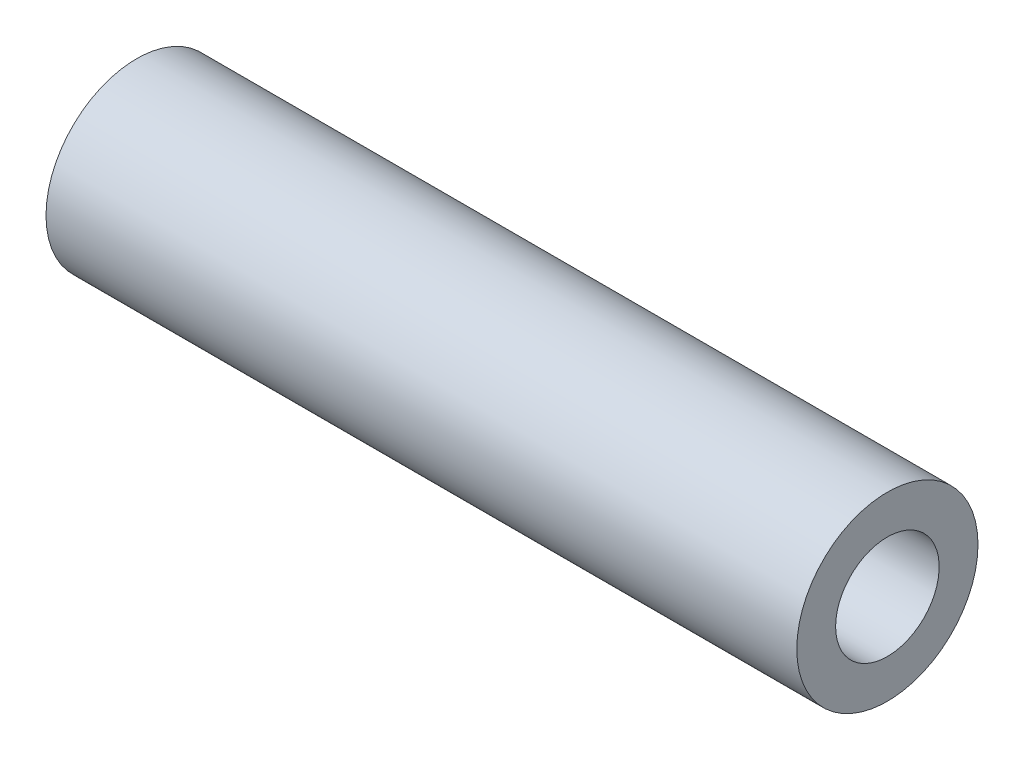
ISO-10303-21;
HEADER;
FILE_DESCRIPTION(('STEP AP214'),'2;1');
FILE_NAME('part.step','',(''),(''),'','','');
FILE_SCHEMA(('AUTOMOTIVE_DESIGN { 1 0 10303 214 1 1 1 1 }'));
ENDSEC;
DATA;
#1=APPLICATION_CONTEXT('core data for automotive mechanical design processes');
#2=APPLICATION_PROTOCOL_DEFINITION('international standard','automotive_design',2000,#1);
#3=PRODUCT_CONTEXT('',#1,'mechanical');
#4=PRODUCT('Part','Part','',(#3));
#5=PRODUCT_RELATED_PRODUCT_CATEGORY('part','',(#4));
#6=PRODUCT_DEFINITION_FORMATION('','',#4);
#7=PRODUCT_DEFINITION_CONTEXT('part definition',#1,'design');
#8=PRODUCT_DEFINITION('design','',#6,#7);
#9=PRODUCT_DEFINITION_SHAPE('','',#8);
#10=(LENGTH_UNIT() NAMED_UNIT(*) SI_UNIT(.MILLI.,.METRE.));
#11=(NAMED_UNIT(*) PLANE_ANGLE_UNIT() SI_UNIT($,.RADIAN.));
#12=(NAMED_UNIT(*) SI_UNIT($,.STERADIAN.) SOLID_ANGLE_UNIT());
#13=UNCERTAINTY_MEASURE_WITH_UNIT(LENGTH_MEASURE(1.E-05),#10,'distance_accuracy_value','');
#14=(GEOMETRIC_REPRESENTATION_CONTEXT(3) GLOBAL_UNCERTAINTY_ASSIGNED_CONTEXT((#13)) GLOBAL_UNIT_ASSIGNED_CONTEXT((#10,
#11,#12)) REPRESENTATION_CONTEXT('',''));
#15=CARTESIAN_POINT('',(0.,0.,0.));
#16=DIRECTION('',(0.,0.,1.));
#17=DIRECTION('',(1.,0.,0.));
#18=AXIS2_PLACEMENT_3D('',#15,#16,#17);
#19=CARTESIAN_POINT('',(-29.,7.,0.));
#20=DIRECTION('',(1.,0.,0.));
#21=DIRECTION('',(0.,0.,-1.));
#22=AXIS2_PLACEMENT_3D('',#19,#20,#21);
#23=PLANE('',#22);
#24=CARTESIAN_POINT('',(-29.,0.,0.));
#25=DIRECTION('',(-1.,0.,0.));
#26=DIRECTION('',(0.,0.,1.));
#27=AXIS2_PLACEMENT_3D('',#24,#25,#26);
#28=CIRCLE('',#27,4.);
#29=CARTESIAN_POINT('',(-29.,0.,4.));
#30=VERTEX_POINT('',#29);
#31=EDGE_CURVE('E10',#30,#30,#28,.T.);
#32=ORIENTED_EDGE('',*,*,#31,.F.);
#33=EDGE_LOOP('',(#32));
#34=FACE_BOUND('',#33,.T.);
#35=CARTESIAN_POINT('',(-29.,0.,0.));
#36=DIRECTION('',(-1.,0.,0.));
#37=DIRECTION('',(0.,0.,1.));
#38=AXIS2_PLACEMENT_3D('',#35,#36,#37);
#39=CIRCLE('',#38,7.);
#40=CARTESIAN_POINT('',(-29.,0.,7.));
#41=VERTEX_POINT('',#40);
#42=EDGE_CURVE('E46',#41,#41,#39,.T.);
#43=ORIENTED_EDGE('',*,*,#42,.T.);
#44=EDGE_LOOP('',(#43));
#45=FACE_BOUND('',#44,.T.);
#46=ADVANCED_FACE('F32',(#34,#45),#23,.F.);
#47=CARTESIAN_POINT('',(0.,0.,0.));
#48=DIRECTION('',(-1.,0.,0.));
#49=DIRECTION('',(0.,0.,1.));
#50=AXIS2_PLACEMENT_3D('',#47,#48,#49);
#51=CYLINDRICAL_SURFACE('',#50,4.);
#52=CARTESIAN_POINT('',(29.,0.,0.));
#53=DIRECTION('',(-1.,0.,0.));
#54=DIRECTION('',(0.,0.,1.));
#55=AXIS2_PLACEMENT_3D('',#52,#53,#54);
#56=CIRCLE('',#55,4.);
#57=CARTESIAN_POINT('',(29.,0.,4.));
#58=VERTEX_POINT('',#57);
#59=EDGE_CURVE('E38',#58,#58,#56,.T.);
#60=ORIENTED_EDGE('',*,*,#59,.F.);
#61=EDGE_LOOP('',(#60));
#62=FACE_BOUND('',#61,.T.);
#63=ORIENTED_EDGE('',*,*,#31,.T.);
#64=EDGE_LOOP('',(#63));
#65=FACE_BOUND('',#64,.T.);
#66=ADVANCED_FACE('F61',(#62,#65),#51,.F.);
#67=CARTESIAN_POINT('',(29.,7.,0.));
#68=DIRECTION('',(-1.,0.,0.));
#69=DIRECTION('',(0.,0.,1.));
#70=AXIS2_PLACEMENT_3D('',#67,#68,#69);
#71=PLANE('',#70);
#72=CARTESIAN_POINT('',(29.,0.,0.));
#73=DIRECTION('',(-1.,0.,0.));
#74=DIRECTION('',(0.,0.,1.));
#75=AXIS2_PLACEMENT_3D('',#72,#73,#74);
#76=CIRCLE('',#75,7.);
#77=CARTESIAN_POINT('',(29.,0.,7.));
#78=VERTEX_POINT('',#77);
#79=EDGE_CURVE('E42',#78,#78,#76,.T.);
#80=ORIENTED_EDGE('',*,*,#79,.F.);
#81=EDGE_LOOP('',(#80));
#82=FACE_BOUND('',#81,.T.);
#83=ORIENTED_EDGE('',*,*,#59,.T.);
#84=EDGE_LOOP('',(#83));
#85=FACE_BOUND('',#84,.T.);
#86=ADVANCED_FACE('F56',(#82,#85),#71,.F.);
#87=CARTESIAN_POINT('',(0.,0.,0.));
#88=DIRECTION('',(-1.,0.,0.));
#89=DIRECTION('',(0.,0.,1.));
#90=AXIS2_PLACEMENT_3D('',#87,#88,#89);
#91=CYLINDRICAL_SURFACE('',#90,7.);
#92=ORIENTED_EDGE('',*,*,#42,.F.);
#93=EDGE_LOOP('',(#92));
#94=FACE_BOUND('',#93,.T.);
#95=ORIENTED_EDGE('',*,*,#79,.T.);
#96=EDGE_LOOP('',(#95));
#97=FACE_BOUND('',#96,.T.);
#98=ADVANCED_FACE('F53',(#94,#97),#91,.T.);
#99=CLOSED_SHELL('',(#46,#66,#86,#98));
#100=MANIFOLD_SOLID_BREP('B2',#99);
#101=ADVANCED_BREP_SHAPE_REPRESENTATION('',(#18,#100),#14);
#102=SHAPE_DEFINITION_REPRESENTATION(#9,#101);
ENDSEC;
END-ISO-10303-21;
